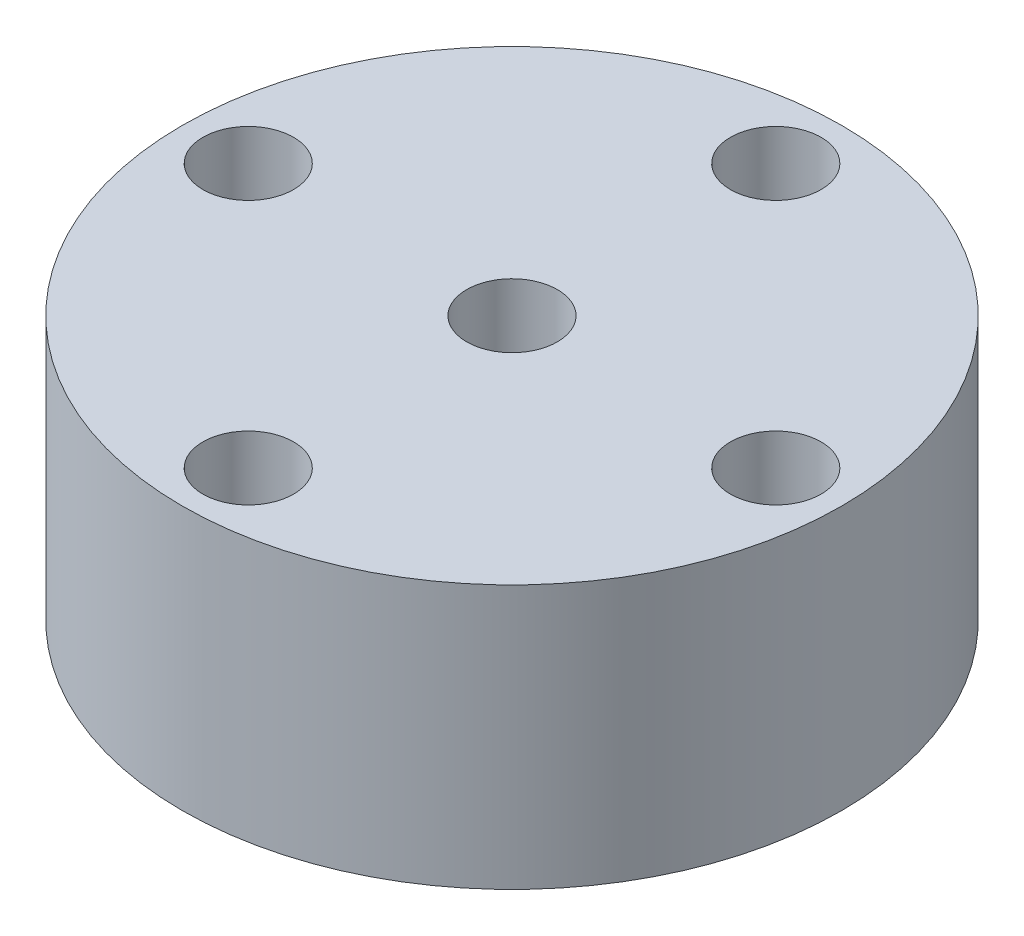
ISO-10303-21;
HEADER;
FILE_DESCRIPTION(('STEP AP214'),'2;1');
FILE_NAME('part.step','',(''),(''),'','','');
FILE_SCHEMA(('AUTOMOTIVE_DESIGN { 1 0 10303 214 1 1 1 1 }'));
ENDSEC;
DATA;
#1=APPLICATION_CONTEXT('core data for automotive mechanical design processes');
#2=APPLICATION_PROTOCOL_DEFINITION('international standard','automotive_design',2000,#1);
#3=PRODUCT_CONTEXT('',#1,'mechanical');
#4=PRODUCT('Part','Part','',(#3));
#5=PRODUCT_RELATED_PRODUCT_CATEGORY('part','',(#4));
#6=PRODUCT_DEFINITION_FORMATION('','',#4);
#7=PRODUCT_DEFINITION_CONTEXT('part definition',#1,'design');
#8=PRODUCT_DEFINITION('design','',#6,#7);
#9=PRODUCT_DEFINITION_SHAPE('','',#8);
#10=(LENGTH_UNIT() NAMED_UNIT(*) SI_UNIT(.MILLI.,.METRE.));
#11=(NAMED_UNIT(*) PLANE_ANGLE_UNIT() SI_UNIT($,.RADIAN.));
#12=(NAMED_UNIT(*) SI_UNIT($,.STERADIAN.) SOLID_ANGLE_UNIT());
#13=UNCERTAINTY_MEASURE_WITH_UNIT(LENGTH_MEASURE(1.E-05),#10,'distance_accuracy_value','');
#14=(GEOMETRIC_REPRESENTATION_CONTEXT(3) GLOBAL_UNCERTAINTY_ASSIGNED_CONTEXT((#13)) GLOBAL_UNIT_ASSIGNED_CONTEXT((#10,
#11,#12)) REPRESENTATION_CONTEXT('',''));
#15=CARTESIAN_POINT('',(0.,0.,0.));
#16=DIRECTION('',(0.,0.,1.));
#17=DIRECTION('',(1.,0.,0.));
#18=AXIS2_PLACEMENT_3D('',#15,#16,#17);
#19=CARTESIAN_POINT('',(0.,12.7,0.));
#20=DIRECTION('',(0.,1.,0.));
#21=DIRECTION('',(0.,0.,1.));
#22=AXIS2_PLACEMENT_3D('',#19,#20,#21);
#23=PLANE('',#22);
#24=CARTESIAN_POINT('',(0.,12.7,-12.7));
#25=DIRECTION('',(0.,1.,0.));
#26=DIRECTION('',(0.,0.,1.));
#27=AXIS2_PLACEMENT_3D('',#24,#25,#26);
#28=CIRCLE('',#27,2.1828125);
#29=CARTESIAN_POINT('',(0.,12.7,-10.5171875));
#30=VERTEX_POINT('',#29);
#31=EDGE_CURVE('E72',#30,#30,#28,.T.);
#32=ORIENTED_EDGE('',*,*,#31,.F.);
#33=EDGE_LOOP('',(#32));
#34=FACE_BOUND('',#33,.T.);
#35=CARTESIAN_POINT('',(12.7,12.7,0.));
#36=DIRECTION('',(0.,1.,0.));
#37=DIRECTION('',(0.,0.,1.));
#38=AXIS2_PLACEMENT_3D('',#35,#36,#37);
#39=CIRCLE('',#38,2.1828125);
#40=CARTESIAN_POINT('',(12.7,12.7,2.1828125));
#41=VERTEX_POINT('',#40);
#42=EDGE_CURVE('E56',#41,#41,#39,.T.);
#43=ORIENTED_EDGE('',*,*,#42,.F.);
#44=EDGE_LOOP('',(#43));
#45=FACE_BOUND('',#44,.T.);
#46=CARTESIAN_POINT('',(0.,12.7,0.));
#47=DIRECTION('',(0.,1.,0.));
#48=DIRECTION('',(0.,0.,1.));
#49=AXIS2_PLACEMENT_3D('',#46,#47,#48);
#50=CIRCLE('',#49,15.875);
#51=CARTESIAN_POINT('',(0.,12.7,15.875));
#52=VERTEX_POINT('',#51);
#53=EDGE_CURVE('E10',#52,#52,#50,.T.);
#54=ORIENTED_EDGE('',*,*,#53,.T.);
#55=EDGE_LOOP('',(#54));
#56=FACE_BOUND('',#55,.T.);
#57=CARTESIAN_POINT('',(0.,12.7,0.));
#58=DIRECTION('',(0.,1.,0.));
#59=DIRECTION('',(0.,0.,1.));
#60=AXIS2_PLACEMENT_3D('',#57,#58,#59);
#61=CIRCLE('',#60,2.1828125);
#62=CARTESIAN_POINT('',(0.,12.7,2.1828125));
#63=VERTEX_POINT('',#62);
#64=EDGE_CURVE('E50',#63,#63,#61,.T.);
#65=ORIENTED_EDGE('',*,*,#64,.F.);
#66=EDGE_LOOP('',(#65));
#67=FACE_BOUND('',#66,.T.);
#68=CARTESIAN_POINT('',(-12.7,12.7,0.));
#69=DIRECTION('',(0.,1.,0.));
#70=DIRECTION('',(0.,0.,1.));
#71=AXIS2_PLACEMENT_3D('',#68,#69,#70);
#72=CIRCLE('',#71,2.1828125);
#73=CARTESIAN_POINT('',(-12.7,12.7,2.1828125));
#74=VERTEX_POINT('',#73);
#75=EDGE_CURVE('E64',#74,#74,#72,.T.);
#76=ORIENTED_EDGE('',*,*,#75,.F.);
#77=EDGE_LOOP('',(#76));
#78=FACE_BOUND('',#77,.T.);
#79=CARTESIAN_POINT('',(0.,12.7,12.7));
#80=DIRECTION('',(0.,1.,0.));
#81=DIRECTION('',(0.,0.,1.));
#82=AXIS2_PLACEMENT_3D('',#79,#80,#81);
#83=CIRCLE('',#82,2.1828125);
#84=CARTESIAN_POINT('',(0.,12.7,14.8828125));
#85=VERTEX_POINT('',#84);
#86=EDGE_CURVE('E80',#85,#85,#83,.T.);
#87=ORIENTED_EDGE('',*,*,#86,.F.);
#88=EDGE_LOOP('',(#87));
#89=FACE_BOUND('',#88,.T.);
#90=ADVANCED_FACE('F37',(#34,#45,#56,#67,#78,#89),#23,.T.);
#91=CARTESIAN_POINT('',(0.,0.,0.));
#92=DIRECTION('',(0.,1.,0.));
#93=DIRECTION('',(0.,0.,1.));
#94=AXIS2_PLACEMENT_3D('',#91,#92,#93);
#95=PLANE('',#94);
#96=CARTESIAN_POINT('',(0.,0.,0.));
#97=DIRECTION('',(0.,1.,0.));
#98=DIRECTION('',(0.,0.,1.));
#99=AXIS2_PLACEMENT_3D('',#96,#97,#98);
#100=CIRCLE('',#99,15.875);
#101=CARTESIAN_POINT('',(0.,0.,15.875));
#102=VERTEX_POINT('',#101);
#103=EDGE_CURVE('E41',#102,#102,#100,.T.);
#104=ORIENTED_EDGE('',*,*,#103,.F.);
#105=EDGE_LOOP('',(#104));
#106=FACE_BOUND('',#105,.T.);
#107=CARTESIAN_POINT('',(0.,0.,0.));
#108=DIRECTION('',(0.,1.,0.));
#109=DIRECTION('',(0.,0.,1.));
#110=AXIS2_PLACEMENT_3D('',#107,#108,#109);
#111=CIRCLE('',#110,2.1828125);
#112=CARTESIAN_POINT('',(0.,0.,2.1828125));
#113=VERTEX_POINT('',#112);
#114=EDGE_CURVE('E52',#113,#113,#111,.T.);
#115=ORIENTED_EDGE('',*,*,#114,.T.);
#116=EDGE_LOOP('',(#115));
#117=FACE_BOUND('',#116,.T.);
#118=CARTESIAN_POINT('',(12.7,0.,0.));
#119=DIRECTION('',(0.,1.,0.));
#120=DIRECTION('',(0.,0.,1.));
#121=AXIS2_PLACEMENT_3D('',#118,#119,#120);
#122=CIRCLE('',#121,2.1828125);
#123=CARTESIAN_POINT('',(12.7,0.,2.1828125));
#124=VERTEX_POINT('',#123);
#125=EDGE_CURVE('E60',#124,#124,#122,.T.);
#126=ORIENTED_EDGE('',*,*,#125,.T.);
#127=EDGE_LOOP('',(#126));
#128=FACE_BOUND('',#127,.T.);
#129=CARTESIAN_POINT('',(-12.7,0.,0.));
#130=DIRECTION('',(0.,1.,0.));
#131=DIRECTION('',(0.,0.,1.));
#132=AXIS2_PLACEMENT_3D('',#129,#130,#131);
#133=CIRCLE('',#132,2.1828125);
#134=CARTESIAN_POINT('',(-12.7,0.,2.1828125));
#135=VERTEX_POINT('',#134);
#136=EDGE_CURVE('E68',#135,#135,#133,.T.);
#137=ORIENTED_EDGE('',*,*,#136,.T.);
#138=EDGE_LOOP('',(#137));
#139=FACE_BOUND('',#138,.T.);
#140=CARTESIAN_POINT('',(0.,0.,-12.7));
#141=DIRECTION('',(0.,1.,0.));
#142=DIRECTION('',(0.,0.,1.));
#143=AXIS2_PLACEMENT_3D('',#140,#141,#142);
#144=CIRCLE('',#143,2.1828125);
#145=CARTESIAN_POINT('',(0.,0.,-10.5171875));
#146=VERTEX_POINT('',#145);
#147=EDGE_CURVE('E76',#146,#146,#144,.T.);
#148=ORIENTED_EDGE('',*,*,#147,.T.);
#149=EDGE_LOOP('',(#148));
#150=FACE_BOUND('',#149,.T.);
#151=CARTESIAN_POINT('',(0.,0.,12.7));
#152=DIRECTION('',(0.,1.,0.));
#153=DIRECTION('',(0.,0.,1.));
#154=AXIS2_PLACEMENT_3D('',#151,#152,#153);
#155=CIRCLE('',#154,2.1828125);
#156=CARTESIAN_POINT('',(0.,0.,14.8828125));
#157=VERTEX_POINT('',#156);
#158=EDGE_CURVE('E84',#157,#157,#155,.T.);
#159=ORIENTED_EDGE('',*,*,#158,.T.);
#160=EDGE_LOOP('',(#159));
#161=FACE_BOUND('',#160,.T.);
#162=ADVANCED_FACE('F96',(#106,#117,#128,#139,#150,#161),#95,.F.);
#163=CARTESIAN_POINT('',(0.,12.7,0.));
#164=DIRECTION('',(0.,-1.,0.));
#165=DIRECTION('',(0.,0.,-1.));
#166=AXIS2_PLACEMENT_3D('',#163,#164,#165);
#167=CYLINDRICAL_SURFACE('',#166,15.875);
#168=ORIENTED_EDGE('',*,*,#53,.F.);
#169=EDGE_LOOP('',(#168));
#170=FACE_BOUND('',#169,.T.);
#171=ORIENTED_EDGE('',*,*,#103,.T.);
#172=EDGE_LOOP('',(#171));
#173=FACE_BOUND('',#172,.T.);
#174=ADVANCED_FACE('F39',(#170,#173),#167,.T.);
#175=CARTESIAN_POINT('',(0.,12.7,0.));
#176=DIRECTION('',(0.,-1.,0.));
#177=DIRECTION('',(0.,0.,-1.));
#178=AXIS2_PLACEMENT_3D('',#175,#176,#177);
#179=CYLINDRICAL_SURFACE('',#178,2.1828125);
#180=ORIENTED_EDGE('',*,*,#64,.T.);
#181=EDGE_LOOP('',(#180));
#182=FACE_BOUND('',#181,.T.);
#183=ORIENTED_EDGE('',*,*,#114,.F.);
#184=EDGE_LOOP('',(#183));
#185=FACE_BOUND('',#184,.T.);
#186=ADVANCED_FACE('F106',(#182,#185),#179,.F.);
#187=CARTESIAN_POINT('',(12.7,12.7,0.));
#188=DIRECTION('',(0.,-1.,0.));
#189=DIRECTION('',(0.,0.,-1.));
#190=AXIS2_PLACEMENT_3D('',#187,#188,#189);
#191=CYLINDRICAL_SURFACE('',#190,2.1828125);
#192=ORIENTED_EDGE('',*,*,#42,.T.);
#193=EDGE_LOOP('',(#192));
#194=FACE_BOUND('',#193,.T.);
#195=ORIENTED_EDGE('',*,*,#125,.F.);
#196=EDGE_LOOP('',(#195));
#197=FACE_BOUND('',#196,.T.);
#198=ADVANCED_FACE('F109',(#194,#197),#191,.F.);
#199=CARTESIAN_POINT('',(-12.7,12.7,0.));
#200=DIRECTION('',(0.,-1.,0.));
#201=DIRECTION('',(0.,0.,-1.));
#202=AXIS2_PLACEMENT_3D('',#199,#200,#201);
#203=CYLINDRICAL_SURFACE('',#202,2.1828125);
#204=ORIENTED_EDGE('',*,*,#75,.T.);
#205=EDGE_LOOP('',(#204));
#206=FACE_BOUND('',#205,.T.);
#207=ORIENTED_EDGE('',*,*,#136,.F.);
#208=EDGE_LOOP('',(#207));
#209=FACE_BOUND('',#208,.T.);
#210=ADVANCED_FACE('F113',(#206,#209),#203,.F.);
#211=CARTESIAN_POINT('',(0.,12.7,-12.7));
#212=DIRECTION('',(0.,-1.,0.));
#213=DIRECTION('',(0.,0.,-1.));
#214=AXIS2_PLACEMENT_3D('',#211,#212,#213);
#215=CYLINDRICAL_SURFACE('',#214,2.1828125);
#216=ORIENTED_EDGE('',*,*,#31,.T.);
#217=EDGE_LOOP('',(#216));
#218=FACE_BOUND('',#217,.T.);
#219=ORIENTED_EDGE('',*,*,#147,.F.);
#220=EDGE_LOOP('',(#219));
#221=FACE_BOUND('',#220,.T.);
#222=ADVANCED_FACE('F117',(#218,#221),#215,.F.);
#223=CARTESIAN_POINT('',(0.,12.7,12.7));
#224=DIRECTION('',(0.,-1.,0.));
#225=DIRECTION('',(0.,0.,-1.));
#226=AXIS2_PLACEMENT_3D('',#223,#224,#225);
#227=CYLINDRICAL_SURFACE('',#226,2.1828125);
#228=ORIENTED_EDGE('',*,*,#86,.T.);
#229=EDGE_LOOP('',(#228));
#230=FACE_BOUND('',#229,.T.);
#231=ORIENTED_EDGE('',*,*,#158,.F.);
#232=EDGE_LOOP('',(#231));
#233=FACE_BOUND('',#232,.T.);
#234=ADVANCED_FACE('F92',(#230,#233),#227,.F.);
#235=CLOSED_SHELL('',(#90,#162,#174,#186,#198,#210,#222,#234));
#236=MANIFOLD_SOLID_BREP('B2',#235);
#237=ADVANCED_BREP_SHAPE_REPRESENTATION('',(#18,#236),#14);
#238=SHAPE_DEFINITION_REPRESENTATION(#9,#237);
ENDSEC;
END-ISO-10303-21;
